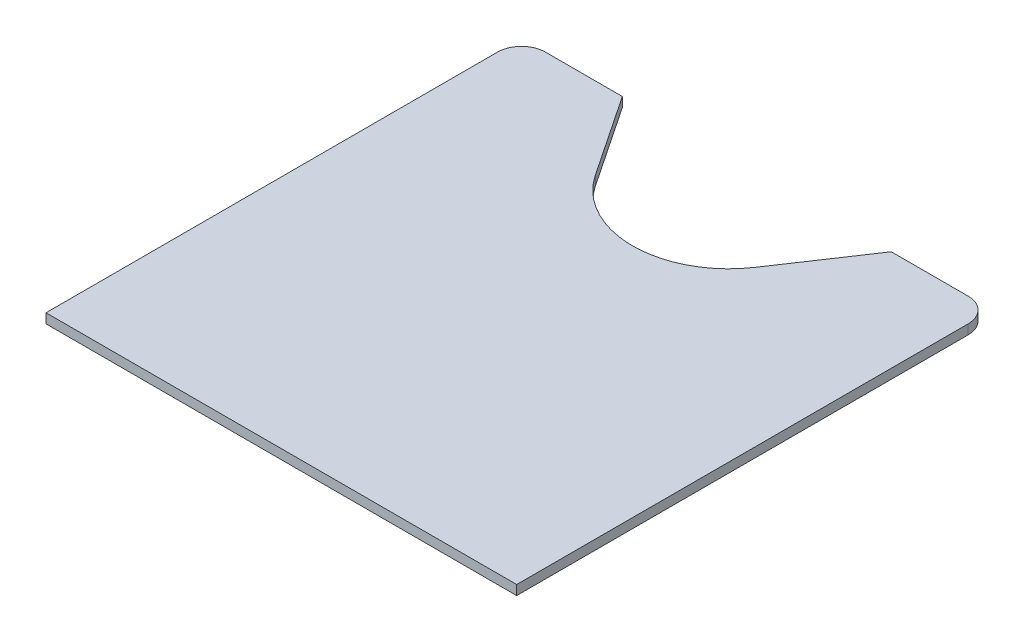
ISO-10303-21;
HEADER;
FILE_DESCRIPTION(('STEP AP214'),'2;1');
FILE_NAME('part.step','',(''),(''),'','','');
FILE_SCHEMA(('AUTOMOTIVE_DESIGN { 1 0 10303 214 1 1 1 1 }'));
ENDSEC;
DATA;
#1=APPLICATION_CONTEXT('core data for automotive mechanical design processes');
#2=APPLICATION_PROTOCOL_DEFINITION('international standard','automotive_design',2000,#1);
#3=PRODUCT_CONTEXT('',#1,'mechanical');
#4=PRODUCT('Part','Part','',(#3));
#5=PRODUCT_RELATED_PRODUCT_CATEGORY('part','',(#4));
#6=PRODUCT_DEFINITION_FORMATION('','',#4);
#7=PRODUCT_DEFINITION_CONTEXT('part definition',#1,'design');
#8=PRODUCT_DEFINITION('design','',#6,#7);
#9=PRODUCT_DEFINITION_SHAPE('','',#8);
#10=(LENGTH_UNIT() NAMED_UNIT(*) SI_UNIT(.MILLI.,.METRE.));
#11=(NAMED_UNIT(*) PLANE_ANGLE_UNIT() SI_UNIT($,.RADIAN.));
#12=(NAMED_UNIT(*) SI_UNIT($,.STERADIAN.) SOLID_ANGLE_UNIT());
#13=UNCERTAINTY_MEASURE_WITH_UNIT(LENGTH_MEASURE(1.E-05),#10,'distance_accuracy_value','');
#14=(GEOMETRIC_REPRESENTATION_CONTEXT(3) GLOBAL_UNCERTAINTY_ASSIGNED_CONTEXT((#13)) GLOBAL_UNIT_ASSIGNED_CONTEXT((#10,
#11,#12)) REPRESENTATION_CONTEXT('',''));
#15=CARTESIAN_POINT('',(0.,0.,0.));
#16=DIRECTION('',(0.,0.,1.));
#17=DIRECTION('',(1.,0.,0.));
#18=AXIS2_PLACEMENT_3D('',#15,#16,#17);
#19=CARTESIAN_POINT('',(44.,2.,-45.));
#20=DIRECTION('',(0.,-1.,0.));
#21=DIRECTION('',(0.,0.,-1.));
#22=AXIS2_PLACEMENT_3D('',#19,#20,#21);
#23=CYLINDRICAL_SURFACE('',#22,5.);
#24=CARTESIAN_POINT('',(44.,0.,-45.));
#25=DIRECTION('',(0.,1.,0.));
#26=DIRECTION('',(0.,0.,1.));
#27=AXIS2_PLACEMENT_3D('',#24,#25,#26);
#28=CIRCLE('',#27,5.);
#29=CARTESIAN_POINT('',(49.,0.,-45.));
#30=VERTEX_POINT('',#29);
#31=CARTESIAN_POINT('',(44.,0.,-50.));
#32=VERTEX_POINT('',#31);
#33=EDGE_CURVE('E145',#30,#32,#28,.T.);
#34=ORIENTED_EDGE('',*,*,#33,.T.);
#35=DIRECTION('',(0.,-1.,0.));
#36=VECTOR('',#35,1.);
#37=CARTESIAN_POINT('',(44.,2.,-50.));
#38=LINE('',#37,#36);
#39=CARTESIAN_POINT('',(44.,2.,-50.));
#40=VERTEX_POINT('',#39);
#41=EDGE_CURVE('E11',#40,#32,#38,.T.);
#42=ORIENTED_EDGE('',*,*,#41,.F.);
#43=CARTESIAN_POINT('',(44.,2.,-45.));
#44=DIRECTION('',(0.,1.,0.));
#45=DIRECTION('',(0.,0.,1.));
#46=AXIS2_PLACEMENT_3D('',#43,#44,#45);
#47=CIRCLE('',#46,5.);
#48=CARTESIAN_POINT('',(49.,2.,-45.));
#49=VERTEX_POINT('',#48);
#50=EDGE_CURVE('E163',#49,#40,#47,.T.);
#51=ORIENTED_EDGE('',*,*,#50,.F.);
#52=DIRECTION('',(0.,-1.,0.));
#53=VECTOR('',#52,1.);
#54=CARTESIAN_POINT('',(49.,2.,-45.));
#55=LINE('',#54,#53);
#56=EDGE_CURVE('E141',#49,#30,#55,.T.);
#57=ORIENTED_EDGE('',*,*,#56,.T.);
#58=EDGE_LOOP('',(#34,#42,#51,#57));
#59=FACE_BOUND('',#58,.T.);
#60=ADVANCED_FACE('F37',(#59),#23,.T.);
#61=CARTESIAN_POINT('',(44.,2.,-50.));
#62=DIRECTION('',(0.,0.,1.));
#63=DIRECTION('',(1.,0.,0.));
#64=AXIS2_PLACEMENT_3D('',#61,#62,#63);
#65=PLANE('',#64);
#66=DIRECTION('',(-1.,0.,0.));
#67=VECTOR('',#66,1.);
#68=CARTESIAN_POINT('',(44.,0.,-50.));
#69=LINE('',#68,#67);
#70=CARTESIAN_POINT('',(28.,0.,-50.));
#71=VERTEX_POINT('',#70);
#72=EDGE_CURVE('E148',#32,#71,#69,.T.);
#73=ORIENTED_EDGE('',*,*,#72,.T.);
#74=DIRECTION('',(0.,-1.,0.));
#75=VECTOR('',#74,1.);
#76=CARTESIAN_POINT('',(28.,2.,-50.));
#77=LINE('',#76,#75);
#78=CARTESIAN_POINT('',(28.,2.,-50.));
#79=VERTEX_POINT('',#78);
#80=EDGE_CURVE('E45',#79,#71,#77,.T.);
#81=ORIENTED_EDGE('',*,*,#80,.F.);
#82=DIRECTION('',(-1.,0.,0.));
#83=VECTOR('',#82,1.);
#84=CARTESIAN_POINT('',(44.,2.,-50.));
#85=LINE('',#84,#83);
#86=EDGE_CURVE('E102',#40,#79,#85,.T.);
#87=ORIENTED_EDGE('',*,*,#86,.F.);
#88=ORIENTED_EDGE('',*,*,#41,.T.);
#89=EDGE_LOOP('',(#73,#81,#87,#88));
#90=FACE_BOUND('',#89,.T.);
#91=ADVANCED_FACE('F212',(#90),#65,.F.);
#92=CARTESIAN_POINT('',(28.,2.,-50.));
#93=DIRECTION('',(0.830992610482314,0.,0.556283454116505));
#94=DIRECTION('',(0.556283454116505,0.,-0.830992610482314));
#95=AXIS2_PLACEMENT_3D('',#92,#93,#94);
#96=PLANE('',#95);
#97=DIRECTION('',(-0.556283454116505,0.,0.830992610482314));
#98=VECTOR('',#97,1.);
#99=CARTESIAN_POINT('',(28.,0.,-50.));
#100=LINE('',#99,#98);
#101=CARTESIAN_POINT('',(16.6198522096463,0.,-33.));
#102=VERTEX_POINT('',#101);
#103=EDGE_CURVE('E150',#71,#102,#100,.T.);
#104=ORIENTED_EDGE('',*,*,#103,.T.);
#105=DIRECTION('',(0.,-1.,0.));
#106=VECTOR('',#105,1.);
#107=CARTESIAN_POINT('',(16.6198522096463,2.,-33.));
#108=LINE('',#107,#106);
#109=CARTESIAN_POINT('',(16.6198522096463,2.,-33.));
#110=VERTEX_POINT('',#109);
#111=EDGE_CURVE('E176',#110,#102,#108,.T.);
#112=ORIENTED_EDGE('',*,*,#111,.F.);
#113=DIRECTION('',(-0.556283454116505,0.,0.830992610482314));
#114=VECTOR('',#113,1.);
#115=CARTESIAN_POINT('',(28.,2.,-50.));
#116=LINE('',#115,#114);
#117=EDGE_CURVE('E184',#79,#110,#116,.T.);
#118=ORIENTED_EDGE('',*,*,#117,.F.);
#119=ORIENTED_EDGE('',*,*,#80,.T.);
#120=EDGE_LOOP('',(#104,#112,#118,#119));
#121=FACE_BOUND('',#120,.T.);
#122=ADVANCED_FACE('F182',(#121),#96,.F.);
#123=CARTESIAN_POINT('',(0.,2.,-44.1256690823301));
#124=DIRECTION('',(0.,-1.,0.));
#125=DIRECTION('',(0.,0.,-1.));
#126=AXIS2_PLACEMENT_3D('',#123,#124,#125);
#127=CYLINDRICAL_SURFACE('',#126,20.);
#128=CARTESIAN_POINT('',(0.,0.,-44.1256690823301));
#129=DIRECTION('',(0.,-1.,0.));
#130=DIRECTION('',(0.,0.,1.));
#131=AXIS2_PLACEMENT_3D('',#128,#129,#130);
#132=CIRCLE('',#131,20.);
#133=CARTESIAN_POINT('',(-16.6198522096463,0.,-33.));
#134=VERTEX_POINT('',#133);
#135=EDGE_CURVE('E152',#102,#134,#132,.T.);
#136=ORIENTED_EDGE('',*,*,#135,.T.);
#137=DIRECTION('',(0.,-1.,0.));
#138=VECTOR('',#137,1.);
#139=CARTESIAN_POINT('',(-16.6198522096463,2.,-33.));
#140=LINE('',#139,#138);
#141=CARTESIAN_POINT('',(-16.6198522096463,2.,-33.));
#142=VERTEX_POINT('',#141);
#143=EDGE_CURVE('E173',#142,#134,#140,.T.);
#144=ORIENTED_EDGE('',*,*,#143,.F.);
#145=CARTESIAN_POINT('',(0.,2.,-44.1256690823301));
#146=DIRECTION('',(0.,-1.,0.));
#147=DIRECTION('',(0.,0.,1.));
#148=AXIS2_PLACEMENT_3D('',#145,#146,#147);
#149=CIRCLE('',#148,20.);
#150=EDGE_CURVE('E202',#110,#142,#149,.T.);
#151=ORIENTED_EDGE('',*,*,#150,.F.);
#152=ORIENTED_EDGE('',*,*,#111,.T.);
#153=EDGE_LOOP('',(#136,#144,#151,#152));
#154=FACE_BOUND('',#153,.T.);
#155=ADVANCED_FACE('F193',(#154),#127,.F.);
#156=CARTESIAN_POINT('',(-28.,2.,-50.));
#157=DIRECTION('',(-0.830992610482314,0.,0.556283454116504));
#158=DIRECTION('',(0.556283454116504,0.,0.830992610482314));
#159=AXIS2_PLACEMENT_3D('',#156,#157,#158);
#160=PLANE('',#159);
#161=DIRECTION('',(-0.556283454116504,0.,-0.830992610482314));
#162=VECTOR('',#161,1.);
#163=CARTESIAN_POINT('',(-28.,0.,-50.));
#164=LINE('',#163,#162);
#165=CARTESIAN_POINT('',(-28.,0.,-50.));
#166=VERTEX_POINT('',#165);
#167=EDGE_CURVE('E154',#134,#166,#164,.T.);
#168=ORIENTED_EDGE('',*,*,#167,.T.);
#169=DIRECTION('',(0.,-1.,0.));
#170=VECTOR('',#169,1.);
#171=CARTESIAN_POINT('',(-28.,2.,-50.));
#172=LINE('',#171,#170);
#173=CARTESIAN_POINT('',(-28.,2.,-50.));
#174=VERTEX_POINT('',#173);
#175=EDGE_CURVE('E170',#174,#166,#172,.T.);
#176=ORIENTED_EDGE('',*,*,#175,.F.);
#177=DIRECTION('',(-0.556283454116504,0.,-0.830992610482314));
#178=VECTOR('',#177,1.);
#179=CARTESIAN_POINT('',(-28.,2.,-50.));
#180=LINE('',#179,#178);
#181=EDGE_CURVE('E199',#142,#174,#180,.T.);
#182=ORIENTED_EDGE('',*,*,#181,.F.);
#183=ORIENTED_EDGE('',*,*,#143,.T.);
#184=EDGE_LOOP('',(#168,#176,#182,#183));
#185=FACE_BOUND('',#184,.T.);
#186=ADVANCED_FACE('F197',(#185),#160,.F.);
#187=CARTESIAN_POINT('',(-44.,2.,-50.));
#188=DIRECTION('',(0.,0.,1.));
#189=DIRECTION('',(1.,0.,0.));
#190=AXIS2_PLACEMENT_3D('',#187,#188,#189);
#191=PLANE('',#190);
#192=DIRECTION('',(-1.,0.,0.));
#193=VECTOR('',#192,1.);
#194=CARTESIAN_POINT('',(-44.,0.,-50.));
#195=LINE('',#194,#193);
#196=CARTESIAN_POINT('',(-44.,0.,-50.));
#197=VERTEX_POINT('',#196);
#198=EDGE_CURVE('E156',#166,#197,#195,.T.);
#199=ORIENTED_EDGE('',*,*,#198,.T.);
#200=DIRECTION('',(0.,-1.,0.));
#201=VECTOR('',#200,1.);
#202=CARTESIAN_POINT('',(-44.,2.,-50.));
#203=LINE('',#202,#201);
#204=CARTESIAN_POINT('',(-44.,2.,-50.));
#205=VERTEX_POINT('',#204);
#206=EDGE_CURVE('E167',#205,#197,#203,.T.);
#207=ORIENTED_EDGE('',*,*,#206,.F.);
#208=DIRECTION('',(-1.,0.,0.));
#209=VECTOR('',#208,1.);
#210=CARTESIAN_POINT('',(-44.,2.,-50.));
#211=LINE('',#210,#209);
#212=EDGE_CURVE('E201',#174,#205,#211,.T.);
#213=ORIENTED_EDGE('',*,*,#212,.F.);
#214=ORIENTED_EDGE('',*,*,#175,.T.);
#215=EDGE_LOOP('',(#199,#207,#213,#214));
#216=FACE_BOUND('',#215,.T.);
#217=ADVANCED_FACE('F224',(#216),#191,.F.);
#218=CARTESIAN_POINT('',(-44.,2.,-45.));
#219=DIRECTION('',(0.,-1.,0.));
#220=DIRECTION('',(0.,0.,-1.));
#221=AXIS2_PLACEMENT_3D('',#218,#219,#220);
#222=CYLINDRICAL_SURFACE('',#221,5.);
#223=CARTESIAN_POINT('',(-44.,0.,-45.));
#224=DIRECTION('',(0.,1.,0.));
#225=DIRECTION('',(0.,0.,-1.));
#226=AXIS2_PLACEMENT_3D('',#223,#224,#225);
#227=CIRCLE('',#226,5.);
#228=CARTESIAN_POINT('',(-49.,0.,-45.));
#229=VERTEX_POINT('',#228);
#230=EDGE_CURVE('E158',#197,#229,#227,.T.);
#231=ORIENTED_EDGE('',*,*,#230,.T.);
#232=DIRECTION('',(0.,-1.,0.));
#233=VECTOR('',#232,1.);
#234=CARTESIAN_POINT('',(-49.,2.,-45.));
#235=LINE('',#234,#233);
#236=CARTESIAN_POINT('',(-49.,2.,-45.));
#237=VERTEX_POINT('',#236);
#238=EDGE_CURVE('E136',#237,#229,#235,.T.);
#239=ORIENTED_EDGE('',*,*,#238,.F.);
#240=CARTESIAN_POINT('',(-44.,2.,-45.));
#241=DIRECTION('',(0.,1.,0.));
#242=DIRECTION('',(0.,0.,-1.));
#243=AXIS2_PLACEMENT_3D('',#240,#241,#242);
#244=CIRCLE('',#243,5.);
#245=EDGE_CURVE('E127',#205,#237,#244,.T.);
#246=ORIENTED_EDGE('',*,*,#245,.F.);
#247=ORIENTED_EDGE('',*,*,#206,.T.);
#248=EDGE_LOOP('',(#231,#239,#246,#247));
#249=FACE_BOUND('',#248,.T.);
#250=ADVANCED_FACE('F227',(#249),#222,.T.);
#251=CARTESIAN_POINT('',(-49.,2.,49.));
#252=DIRECTION('',(1.,0.,0.));
#253=DIRECTION('',(0.,0.,-1.));
#254=AXIS2_PLACEMENT_3D('',#251,#252,#253);
#255=PLANE('',#254);
#256=DIRECTION('',(0.,0.,1.));
#257=VECTOR('',#256,1.);
#258=CARTESIAN_POINT('',(-49.,0.,49.));
#259=LINE('',#258,#257);
#260=CARTESIAN_POINT('',(-49.,0.,49.));
#261=VERTEX_POINT('',#260);
#262=EDGE_CURVE('E135',#229,#261,#259,.T.);
#263=ORIENTED_EDGE('',*,*,#262,.T.);
#264=DIRECTION('',(0.,-1.,0.));
#265=VECTOR('',#264,1.);
#266=CARTESIAN_POINT('',(-49.,2.,49.));
#267=LINE('',#266,#265);
#268=CARTESIAN_POINT('',(-49.,2.,49.));
#269=VERTEX_POINT('',#268);
#270=EDGE_CURVE('E132',#269,#261,#267,.T.);
#271=ORIENTED_EDGE('',*,*,#270,.F.);
#272=DIRECTION('',(0.,0.,1.));
#273=VECTOR('',#272,1.);
#274=CARTESIAN_POINT('',(-49.,2.,49.));
#275=LINE('',#274,#273);
#276=EDGE_CURVE('E121',#237,#269,#275,.T.);
#277=ORIENTED_EDGE('',*,*,#276,.F.);
#278=ORIENTED_EDGE('',*,*,#238,.T.);
#279=EDGE_LOOP('',(#263,#271,#277,#278));
#280=FACE_BOUND('',#279,.T.);
#281=ADVANCED_FACE('F133',(#280),#255,.F.);
#282=CARTESIAN_POINT('',(-49.,2.,49.));
#283=DIRECTION('',(0.,0.,-1.));
#284=DIRECTION('',(-1.,0.,0.));
#285=AXIS2_PLACEMENT_3D('',#282,#283,#284);
#286=PLANE('',#285);
#287=DIRECTION('',(1.,0.,0.));
#288=VECTOR('',#287,1.);
#289=CARTESIAN_POINT('',(-49.,0.,49.));
#290=LINE('',#289,#288);
#291=CARTESIAN_POINT('',(49.,0.,49.));
#292=VERTEX_POINT('',#291);
#293=EDGE_CURVE('E88',#261,#292,#290,.T.);
#294=ORIENTED_EDGE('',*,*,#293,.T.);
#295=DIRECTION('',(0.,-1.,0.));
#296=VECTOR('',#295,1.);
#297=CARTESIAN_POINT('',(49.,2.,49.));
#298=LINE('',#297,#296);
#299=CARTESIAN_POINT('',(49.,2.,49.));
#300=VERTEX_POINT('',#299);
#301=EDGE_CURVE('E137',#300,#292,#298,.T.);
#302=ORIENTED_EDGE('',*,*,#301,.F.);
#303=DIRECTION('',(1.,0.,0.));
#304=VECTOR('',#303,1.);
#305=CARTESIAN_POINT('',(-49.,2.,49.));
#306=LINE('',#305,#304);
#307=EDGE_CURVE('E125',#269,#300,#306,.T.);
#308=ORIENTED_EDGE('',*,*,#307,.F.);
#309=ORIENTED_EDGE('',*,*,#270,.T.);
#310=EDGE_LOOP('',(#294,#302,#308,#309));
#311=FACE_BOUND('',#310,.T.);
#312=ADVANCED_FACE('F139',(#311),#286,.F.);
#313=CARTESIAN_POINT('',(49.,2.,49.));
#314=DIRECTION('',(-1.,0.,0.));
#315=DIRECTION('',(0.,0.,1.));
#316=AXIS2_PLACEMENT_3D('',#313,#314,#315);
#317=PLANE('',#316);
#318=DIRECTION('',(0.,0.,-1.));
#319=VECTOR('',#318,1.);
#320=CARTESIAN_POINT('',(49.,0.,49.));
#321=LINE('',#320,#319);
#322=EDGE_CURVE('E94',#292,#30,#321,.T.);
#323=ORIENTED_EDGE('',*,*,#322,.T.);
#324=ORIENTED_EDGE('',*,*,#56,.F.);
#325=DIRECTION('',(0.,0.,-1.));
#326=VECTOR('',#325,1.);
#327=CARTESIAN_POINT('',(49.,2.,49.));
#328=LINE('',#327,#326);
#329=EDGE_CURVE('E53',#300,#49,#328,.T.);
#330=ORIENTED_EDGE('',*,*,#329,.F.);
#331=ORIENTED_EDGE('',*,*,#301,.T.);
#332=EDGE_LOOP('',(#323,#324,#330,#331));
#333=FACE_BOUND('',#332,.T.);
#334=ADVANCED_FACE('F236',(#333),#317,.F.);
#335=CARTESIAN_POINT('',(44.,2.,-45.));
#336=DIRECTION('',(0.,1.,0.));
#337=DIRECTION('',(0.,0.,1.));
#338=AXIS2_PLACEMENT_3D('',#335,#336,#337);
#339=PLANE('',#338);
#340=ORIENTED_EDGE('',*,*,#50,.T.);
#341=ORIENTED_EDGE('',*,*,#86,.T.);
#342=ORIENTED_EDGE('',*,*,#117,.T.);
#343=ORIENTED_EDGE('',*,*,#150,.T.);
#344=ORIENTED_EDGE('',*,*,#181,.T.);
#345=ORIENTED_EDGE('',*,*,#212,.T.);
#346=ORIENTED_EDGE('',*,*,#245,.T.);
#347=ORIENTED_EDGE('',*,*,#276,.T.);
#348=ORIENTED_EDGE('',*,*,#307,.T.);
#349=ORIENTED_EDGE('',*,*,#329,.T.);
#350=EDGE_LOOP('',(#340,#341,#342,#343,#344,#345,#346,#347,#348,#349));
#351=FACE_BOUND('',#350,.T.);
#352=ADVANCED_FACE('F123',(#351),#339,.T.);
#353=CARTESIAN_POINT('',(44.,0.,-45.));
#354=DIRECTION('',(0.,1.,0.));
#355=DIRECTION('',(0.,0.,1.));
#356=AXIS2_PLACEMENT_3D('',#353,#354,#355);
#357=PLANE('',#356);
#358=ORIENTED_EDGE('',*,*,#33,.F.);
#359=ORIENTED_EDGE('',*,*,#322,.F.);
#360=ORIENTED_EDGE('',*,*,#293,.F.);
#361=ORIENTED_EDGE('',*,*,#262,.F.);
#362=ORIENTED_EDGE('',*,*,#230,.F.);
#363=ORIENTED_EDGE('',*,*,#198,.F.);
#364=ORIENTED_EDGE('',*,*,#167,.F.);
#365=ORIENTED_EDGE('',*,*,#135,.F.);
#366=ORIENTED_EDGE('',*,*,#103,.F.);
#367=ORIENTED_EDGE('',*,*,#72,.F.);
#368=EDGE_LOOP('',(#358,#359,#360,#361,#362,#363,#364,#365,#366,#367));
#369=FACE_BOUND('',#368,.T.);
#370=ADVANCED_FACE('F188',(#369),#357,.F.);
#371=CLOSED_SHELL('',(#60,#91,#122,#155,#186,#217,#250,#281,#312,#334,#352,#370));
#372=MANIFOLD_SOLID_BREP('B2',#371);
#373=ADVANCED_BREP_SHAPE_REPRESENTATION('',(#18,#372),#14);
#374=SHAPE_DEFINITION_REPRESENTATION(#9,#373);
ENDSEC;
END-ISO-10303-21;
